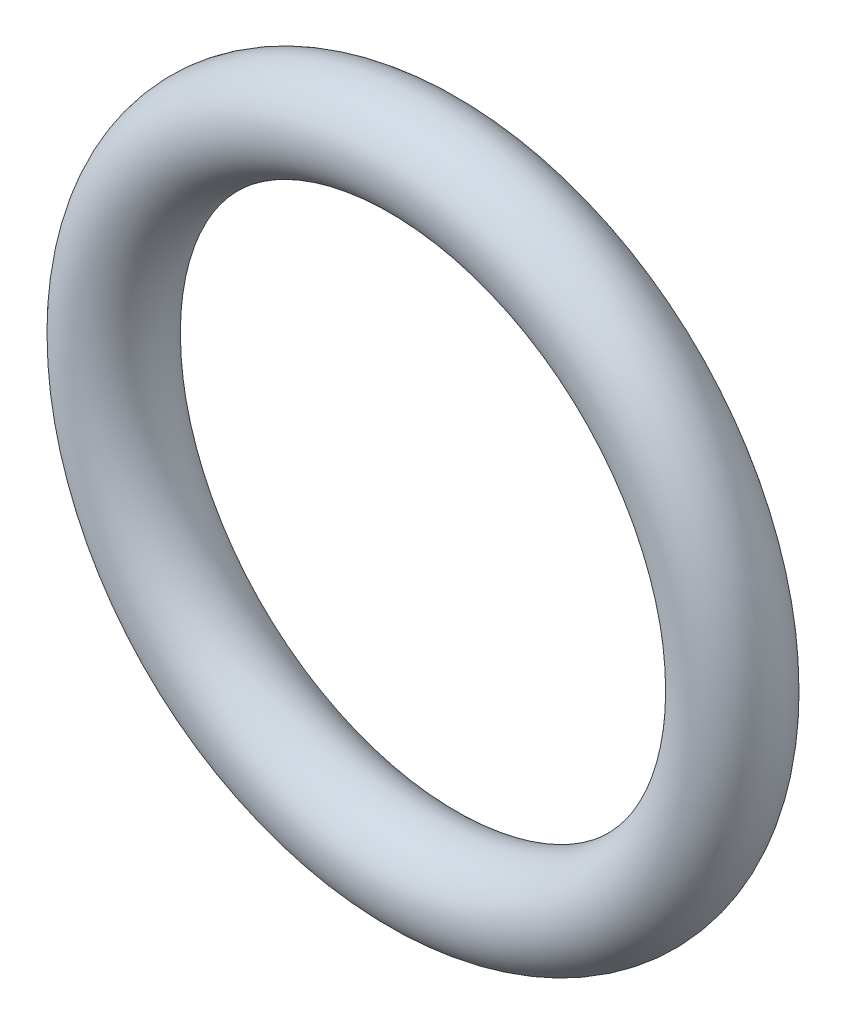
ISO-10303-21;
HEADER;
FILE_DESCRIPTION(('STEP AP214'),'2;1');
FILE_NAME('part.step','',(''),(''),'','','');
FILE_SCHEMA(('AUTOMOTIVE_DESIGN { 1 0 10303 214 1 1 1 1 }'));
ENDSEC;
DATA;
#1=APPLICATION_CONTEXT('core data for automotive mechanical design processes');
#2=APPLICATION_PROTOCOL_DEFINITION('international standard','automotive_design',2000,#1);
#3=PRODUCT_CONTEXT('',#1,'mechanical');
#4=PRODUCT('Part','Part','',(#3));
#5=PRODUCT_RELATED_PRODUCT_CATEGORY('part','',(#4));
#6=PRODUCT_DEFINITION_FORMATION('','',#4);
#7=PRODUCT_DEFINITION_CONTEXT('part definition',#1,'design');
#8=PRODUCT_DEFINITION('design','',#6,#7);
#9=PRODUCT_DEFINITION_SHAPE('','',#8);
#10=(LENGTH_UNIT() NAMED_UNIT(*) SI_UNIT(.MILLI.,.METRE.));
#11=(NAMED_UNIT(*) PLANE_ANGLE_UNIT() SI_UNIT($,.RADIAN.));
#12=(NAMED_UNIT(*) SI_UNIT($,.STERADIAN.) SOLID_ANGLE_UNIT());
#13=UNCERTAINTY_MEASURE_WITH_UNIT(LENGTH_MEASURE(1.E-05),#10,'distance_accuracy_value','');
#14=(GEOMETRIC_REPRESENTATION_CONTEXT(3) GLOBAL_UNCERTAINTY_ASSIGNED_CONTEXT((#13)) GLOBAL_UNIT_ASSIGNED_CONTEXT((#10,
#11,#12)) REPRESENTATION_CONTEXT('',''));
#15=CARTESIAN_POINT('',(0.,0.,0.));
#16=DIRECTION('',(0.,0.,1.));
#17=DIRECTION('',(1.,0.,0.));
#18=AXIS2_PLACEMENT_3D('',#15,#16,#17);
#19=CARTESIAN_POINT('',(0.,0.,0.));
#20=DIRECTION('',(0.,0.,-1.));
#21=DIRECTION('',(-1.,0.,0.));
#22=AXIS2_PLACEMENT_3D('',#19,#20,#21);
#23=TOROIDAL_SURFACE('',#22,5.9,0.9);
#24=CARTESIAN_POINT('',(-6.8,0.,0.));
#25=VERTEX_POINT('',#24);
#26=VERTEX_LOOP('',#25);
#27=FACE_BOUND('',#26,.T.);
#28=ADVANCED_FACE('F37',(#27),#23,.T.);
#29=CLOSED_SHELL('',(#28));
#30=MANIFOLD_SOLID_BREP('B2',#29);
#31=ADVANCED_BREP_SHAPE_REPRESENTATION('',(#18,#30),#14);
#32=SHAPE_DEFINITION_REPRESENTATION(#9,#31);
ENDSEC;
END-ISO-10303-21;
